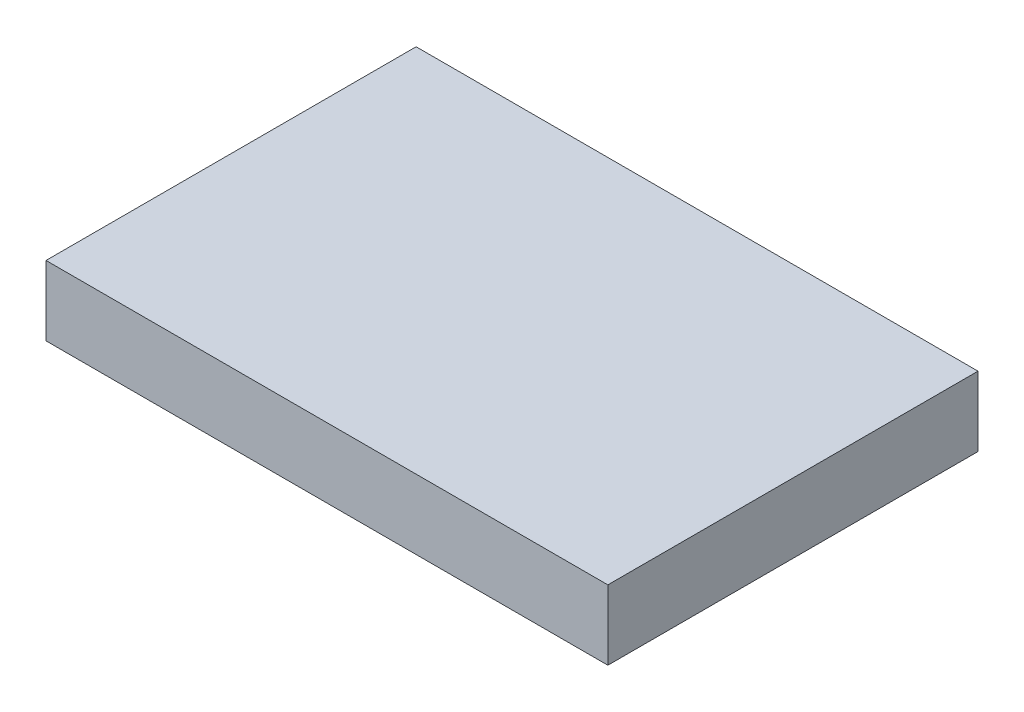
ISO-10303-21;
HEADER;
FILE_DESCRIPTION(('STEP AP214'),'2;1');
FILE_NAME('part.step','',(''),(''),'','','');
FILE_SCHEMA(('AUTOMOTIVE_DESIGN { 1 0 10303 214 1 1 1 1 }'));
ENDSEC;
DATA;
#1=APPLICATION_CONTEXT('core data for automotive mechanical design processes');
#2=APPLICATION_PROTOCOL_DEFINITION('international standard','automotive_design',2000,#1);
#3=PRODUCT_CONTEXT('',#1,'mechanical');
#4=PRODUCT('Part','Part','',(#3));
#5=PRODUCT_RELATED_PRODUCT_CATEGORY('part','',(#4));
#6=PRODUCT_DEFINITION_FORMATION('','',#4);
#7=PRODUCT_DEFINITION_CONTEXT('part definition',#1,'design');
#8=PRODUCT_DEFINITION('design','',#6,#7);
#9=PRODUCT_DEFINITION_SHAPE('','',#8);
#10=(LENGTH_UNIT() NAMED_UNIT(*) SI_UNIT(.MILLI.,.METRE.));
#11=(NAMED_UNIT(*) PLANE_ANGLE_UNIT() SI_UNIT($,.RADIAN.));
#12=(NAMED_UNIT(*) SI_UNIT($,.STERADIAN.) SOLID_ANGLE_UNIT());
#13=UNCERTAINTY_MEASURE_WITH_UNIT(LENGTH_MEASURE(1.E-05),#10,'distance_accuracy_value','');
#14=(GEOMETRIC_REPRESENTATION_CONTEXT(3) GLOBAL_UNCERTAINTY_ASSIGNED_CONTEXT((#13)) GLOBAL_UNIT_ASSIGNED_CONTEXT((#10,
#11,#12)) REPRESENTATION_CONTEXT('',''));
#15=CARTESIAN_POINT('',(0.,0.,0.));
#16=DIRECTION('',(0.,0.,1.));
#17=DIRECTION('',(1.,0.,0.));
#18=AXIS2_PLACEMENT_3D('',#15,#16,#17);
#19=CARTESIAN_POINT('',(0.,10.,0.));
#20=DIRECTION('',(1.,0.,0.));
#21=DIRECTION('',(0.,0.,-1.));
#22=AXIS2_PLACEMENT_3D('',#19,#20,#21);
#23=PLANE('',#22);
#24=DIRECTION('',(0.,0.,1.));
#25=VECTOR('',#24,1.);
#26=CARTESIAN_POINT('',(0.,0.,0.));
#27=LINE('',#26,#25);
#28=CARTESIAN_POINT('',(0.,0.,-53.1574077937449));
#29=VERTEX_POINT('',#28);
#30=CARTESIAN_POINT('',(0.,0.,0.));
#31=VERTEX_POINT('',#30);
#32=EDGE_CURVE('E113',#29,#31,#27,.T.);
#33=ORIENTED_EDGE('',*,*,#32,.T.);
#34=DIRECTION('',(0.,-1.,0.));
#35=VECTOR('',#34,1.);
#36=CARTESIAN_POINT('',(0.,10.,0.));
#37=LINE('',#36,#35);
#38=CARTESIAN_POINT('',(0.,10.,0.));
#39=VERTEX_POINT('',#38);
#40=EDGE_CURVE('E11',#39,#31,#37,.T.);
#41=ORIENTED_EDGE('',*,*,#40,.F.);
#42=DIRECTION('',(0.,0.,1.));
#43=VECTOR('',#42,1.);
#44=CARTESIAN_POINT('',(0.,10.,0.));
#45=LINE('',#44,#43);
#46=CARTESIAN_POINT('',(0.,10.,-53.1574077937449));
#47=VERTEX_POINT('',#46);
#48=EDGE_CURVE('E97',#47,#39,#45,.T.);
#49=ORIENTED_EDGE('',*,*,#48,.F.);
#50=DIRECTION('',(0.,-1.,0.));
#51=VECTOR('',#50,1.);
#52=CARTESIAN_POINT('',(0.,10.,-53.1574077937449));
#53=LINE('',#52,#51);
#54=EDGE_CURVE('E109',#47,#29,#53,.T.);
#55=ORIENTED_EDGE('',*,*,#54,.T.);
#56=EDGE_LOOP('',(#33,#41,#49,#55));
#57=FACE_BOUND('',#56,.T.);
#58=ADVANCED_FACE('F45',(#57),#23,.F.);
#59=CARTESIAN_POINT('',(0.,10.,0.));
#60=DIRECTION('',(0.,0.,-1.));
#61=DIRECTION('',(-1.,0.,0.));
#62=AXIS2_PLACEMENT_3D('',#59,#60,#61);
#63=PLANE('',#62);
#64=DIRECTION('',(1.,0.,0.));
#65=VECTOR('',#64,1.);
#66=CARTESIAN_POINT('',(0.,0.,0.));
#67=LINE('',#66,#65);
#68=CARTESIAN_POINT('',(80.6939028220362,0.,0.));
#69=VERTEX_POINT('',#68);
#70=EDGE_CURVE('E102',#31,#69,#67,.T.);
#71=ORIENTED_EDGE('',*,*,#70,.T.);
#72=DIRECTION('',(0.,-1.,0.));
#73=VECTOR('',#72,1.);
#74=CARTESIAN_POINT('',(80.6939028220362,10.,0.));
#75=LINE('',#74,#73);
#76=CARTESIAN_POINT('',(80.6939028220362,10.,0.));
#77=VERTEX_POINT('',#76);
#78=EDGE_CURVE('E54',#77,#69,#75,.T.);
#79=ORIENTED_EDGE('',*,*,#78,.F.);
#80=DIRECTION('',(1.,0.,0.));
#81=VECTOR('',#80,1.);
#82=CARTESIAN_POINT('',(0.,10.,0.));
#83=LINE('',#82,#81);
#84=EDGE_CURVE('E92',#39,#77,#83,.T.);
#85=ORIENTED_EDGE('',*,*,#84,.F.);
#86=ORIENTED_EDGE('',*,*,#40,.T.);
#87=EDGE_LOOP('',(#71,#79,#85,#86));
#88=FACE_BOUND('',#87,.T.);
#89=ADVANCED_FACE('F101',(#88),#63,.F.);
#90=CARTESIAN_POINT('',(80.6939028220362,10.,0.));
#91=DIRECTION('',(-1.,0.,0.));
#92=DIRECTION('',(0.,0.,1.));
#93=AXIS2_PLACEMENT_3D('',#90,#91,#92);
#94=PLANE('',#93);
#95=DIRECTION('',(0.,0.,-1.));
#96=VECTOR('',#95,1.);
#97=CARTESIAN_POINT('',(80.6939028220362,0.,0.));
#98=LINE('',#97,#96);
#99=CARTESIAN_POINT('',(80.6939028220362,0.,-53.1574077937449));
#100=VERTEX_POINT('',#99);
#101=EDGE_CURVE('E79',#69,#100,#98,.T.);
#102=ORIENTED_EDGE('',*,*,#101,.T.);
#103=DIRECTION('',(0.,-1.,0.));
#104=VECTOR('',#103,1.);
#105=CARTESIAN_POINT('',(80.6939028220362,10.,-53.1574077937449));
#106=LINE('',#105,#104);
#107=CARTESIAN_POINT('',(80.6939028220362,10.,-53.1574077937449));
#108=VERTEX_POINT('',#107);
#109=EDGE_CURVE('E104',#108,#100,#106,.T.);
#110=ORIENTED_EDGE('',*,*,#109,.F.);
#111=DIRECTION('',(0.,0.,-1.));
#112=VECTOR('',#111,1.);
#113=CARTESIAN_POINT('',(80.6939028220362,10.,0.));
#114=LINE('',#113,#112);
#115=EDGE_CURVE('E95',#77,#108,#114,.T.);
#116=ORIENTED_EDGE('',*,*,#115,.F.);
#117=ORIENTED_EDGE('',*,*,#78,.T.);
#118=EDGE_LOOP('',(#102,#110,#116,#117));
#119=FACE_BOUND('',#118,.T.);
#120=ADVANCED_FACE('F105',(#119),#94,.F.);
#121=CARTESIAN_POINT('',(0.,10.,-53.1574077937449));
#122=DIRECTION('',(0.,0.,1.));
#123=DIRECTION('',(1.,0.,0.));
#124=AXIS2_PLACEMENT_3D('',#121,#122,#123);
#125=PLANE('',#124);
#126=DIRECTION('',(-1.,0.,0.));
#127=VECTOR('',#126,1.);
#128=CARTESIAN_POINT('',(0.,0.,-53.1574077937449));
#129=LINE('',#128,#127);
#130=EDGE_CURVE('E85',#100,#29,#129,.T.);
#131=ORIENTED_EDGE('',*,*,#130,.T.);
#132=ORIENTED_EDGE('',*,*,#54,.F.);
#133=DIRECTION('',(-1.,0.,0.));
#134=VECTOR('',#133,1.);
#135=CARTESIAN_POINT('',(0.,10.,-53.1574077937449));
#136=LINE('',#135,#134);
#137=EDGE_CURVE('E62',#108,#47,#136,.T.);
#138=ORIENTED_EDGE('',*,*,#137,.F.);
#139=ORIENTED_EDGE('',*,*,#109,.T.);
#140=EDGE_LOOP('',(#131,#132,#138,#139));
#141=FACE_BOUND('',#140,.T.);
#142=ADVANCED_FACE('F126',(#141),#125,.F.);
#143=CARTESIAN_POINT('',(0.,10.,0.));
#144=DIRECTION('',(0.,-1.,0.));
#145=DIRECTION('',(0.,0.,-1.));
#146=AXIS2_PLACEMENT_3D('',#143,#144,#145);
#147=PLANE('',#146);
#148=ORIENTED_EDGE('',*,*,#48,.T.);
#149=ORIENTED_EDGE('',*,*,#84,.T.);
#150=ORIENTED_EDGE('',*,*,#115,.T.);
#151=ORIENTED_EDGE('',*,*,#137,.T.);
#152=EDGE_LOOP('',(#148,#149,#150,#151));
#153=FACE_BOUND('',#152,.T.);
#154=ADVANCED_FACE('F93',(#153),#147,.F.);
#155=CARTESIAN_POINT('',(0.,0.,0.));
#156=DIRECTION('',(0.,-1.,0.));
#157=DIRECTION('',(0.,0.,-1.));
#158=AXIS2_PLACEMENT_3D('',#155,#156,#157);
#159=PLANE('',#158);
#160=ORIENTED_EDGE('',*,*,#32,.F.);
#161=ORIENTED_EDGE('',*,*,#130,.F.);
#162=ORIENTED_EDGE('',*,*,#101,.F.);
#163=ORIENTED_EDGE('',*,*,#70,.F.);
#164=EDGE_LOOP('',(#160,#161,#162,#163));
#165=FACE_BOUND('',#164,.T.);
#166=ADVANCED_FACE('F129',(#165),#159,.T.);
#167=CLOSED_SHELL('',(#58,#89,#120,#142,#154,#166));
#168=MANIFOLD_SOLID_BREP('B2',#167);
#169=ADVANCED_BREP_SHAPE_REPRESENTATION('',(#18,#168),#14);
#170=SHAPE_DEFINITION_REPRESENTATION(#9,#169);
ENDSEC;
END-ISO-10303-21;
